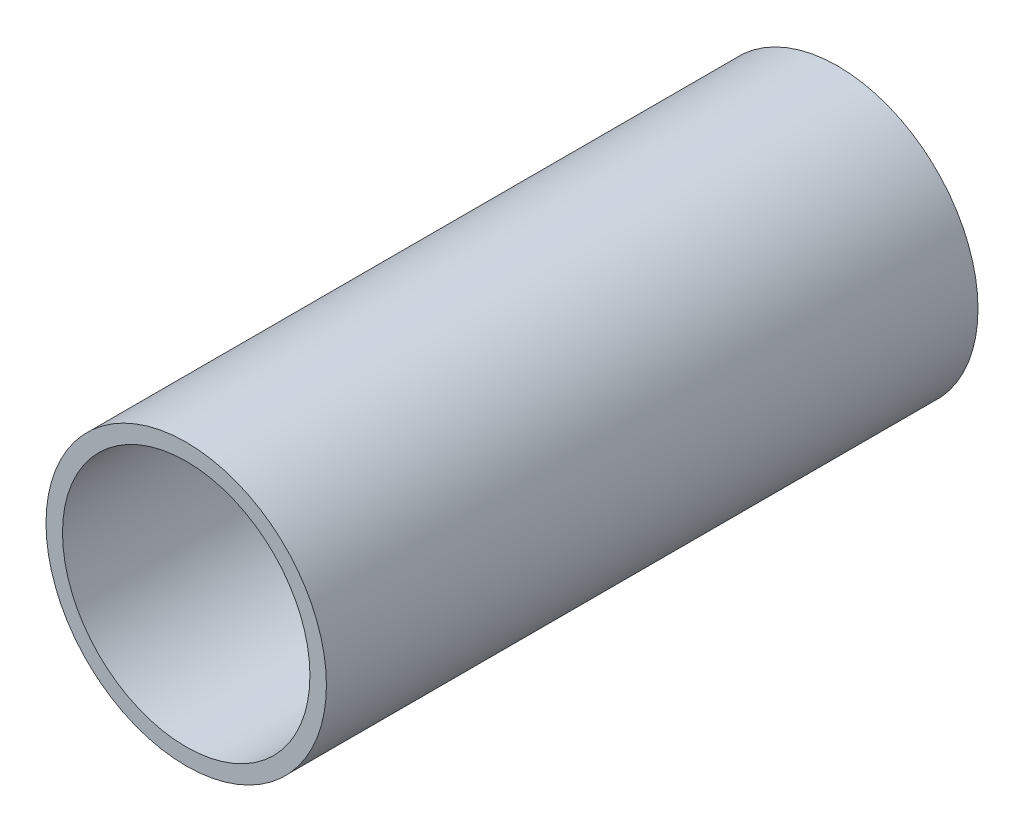
ISO-10303-21;
HEADER;
FILE_DESCRIPTION(('STEP AP214'),'2;1');
FILE_NAME('part.step','',(''),(''),'','','');
FILE_SCHEMA(('AUTOMOTIVE_DESIGN { 1 0 10303 214 1 1 1 1 }'));
ENDSEC;
DATA;
#1=APPLICATION_CONTEXT('core data for automotive mechanical design processes');
#2=APPLICATION_PROTOCOL_DEFINITION('international standard','automotive_design',2000,#1);
#3=PRODUCT_CONTEXT('',#1,'mechanical');
#4=PRODUCT('Part','Part','',(#3));
#5=PRODUCT_RELATED_PRODUCT_CATEGORY('part','',(#4));
#6=PRODUCT_DEFINITION_FORMATION('','',#4);
#7=PRODUCT_DEFINITION_CONTEXT('part definition',#1,'design');
#8=PRODUCT_DEFINITION('design','',#6,#7);
#9=PRODUCT_DEFINITION_SHAPE('','',#8);
#10=(LENGTH_UNIT() NAMED_UNIT(*) SI_UNIT(.MILLI.,.METRE.));
#11=(NAMED_UNIT(*) PLANE_ANGLE_UNIT() SI_UNIT($,.RADIAN.));
#12=(NAMED_UNIT(*) SI_UNIT($,.STERADIAN.) SOLID_ANGLE_UNIT());
#13=UNCERTAINTY_MEASURE_WITH_UNIT(LENGTH_MEASURE(1.E-05),#10,'distance_accuracy_value','');
#14=(GEOMETRIC_REPRESENTATION_CONTEXT(3) GLOBAL_UNCERTAINTY_ASSIGNED_CONTEXT((#13)) GLOBAL_UNIT_ASSIGNED_CONTEXT((#10,
#11,#12)) REPRESENTATION_CONTEXT('',''));
#15=CARTESIAN_POINT('',(0.,0.,0.));
#16=DIRECTION('',(0.,0.,1.));
#17=DIRECTION('',(1.,0.,0.));
#18=AXIS2_PLACEMENT_3D('',#15,#16,#17);
#19=CARTESIAN_POINT('',(0.,0.,395.));
#20=DIRECTION('',(0.,0.,1.));
#21=DIRECTION('',(1.,0.,0.));
#22=AXIS2_PLACEMENT_3D('',#19,#20,#21);
#23=PLANE('',#22);
#24=CARTESIAN_POINT('',(0.,0.,395.));
#25=DIRECTION('',(0.,0.,1.));
#26=DIRECTION('',(1.,0.,0.));
#27=AXIS2_PLACEMENT_3D('',#24,#25,#26);
#28=CIRCLE('',#27,85.);
#29=CARTESIAN_POINT('',(-85.,0.,395.));
#30=VERTEX_POINT('',#29);
#31=EDGE_CURVE('E10',#30,#30,#28,.T.);
#32=ORIENTED_EDGE('',*,*,#31,.T.);
#33=EDGE_LOOP('',(#32));
#34=FACE_BOUND('',#33,.T.);
#35=CARTESIAN_POINT('',(0.,0.,395.));
#36=DIRECTION('',(0.,0.,1.));
#37=DIRECTION('',(1.,0.,0.));
#38=AXIS2_PLACEMENT_3D('',#35,#36,#37);
#39=CIRCLE('',#38,75.);
#40=CARTESIAN_POINT('',(-75.,0.,395.));
#41=VERTEX_POINT('',#40);
#42=EDGE_CURVE('E41',#41,#41,#39,.T.);
#43=ORIENTED_EDGE('',*,*,#42,.F.);
#44=EDGE_LOOP('',(#43));
#45=FACE_BOUND('',#44,.T.);
#46=ADVANCED_FACE('F30',(#34,#45),#23,.T.);
#47=CARTESIAN_POINT('',(0.,0.,0.));
#48=DIRECTION('',(0.,0.,1.));
#49=DIRECTION('',(1.,0.,0.));
#50=AXIS2_PLACEMENT_3D('',#47,#48,#49);
#51=PLANE('',#50);
#52=CARTESIAN_POINT('',(0.,0.,0.));
#53=DIRECTION('',(0.,0.,1.));
#54=DIRECTION('',(1.,0.,0.));
#55=AXIS2_PLACEMENT_3D('',#52,#53,#54);
#56=CIRCLE('',#55,85.);
#57=CARTESIAN_POINT('',(-85.,0.,0.));
#58=VERTEX_POINT('',#57);
#59=EDGE_CURVE('E34',#58,#58,#56,.T.);
#60=ORIENTED_EDGE('',*,*,#59,.F.);
#61=EDGE_LOOP('',(#60));
#62=FACE_BOUND('',#61,.T.);
#63=CARTESIAN_POINT('',(0.,0.,0.));
#64=DIRECTION('',(0.,0.,1.));
#65=DIRECTION('',(1.,0.,0.));
#66=AXIS2_PLACEMENT_3D('',#63,#64,#65);
#67=CIRCLE('',#66,75.);
#68=CARTESIAN_POINT('',(-75.,0.,0.));
#69=VERTEX_POINT('',#68);
#70=EDGE_CURVE('E43',#69,#69,#67,.T.);
#71=ORIENTED_EDGE('',*,*,#70,.T.);
#72=EDGE_LOOP('',(#71));
#73=FACE_BOUND('',#72,.T.);
#74=ADVANCED_FACE('F53',(#62,#73),#51,.F.);
#75=CARTESIAN_POINT('',(0.,0.,395.));
#76=DIRECTION('',(0.,0.,-1.));
#77=DIRECTION('',(-1.,0.,0.));
#78=AXIS2_PLACEMENT_3D('',#75,#76,#77);
#79=CYLINDRICAL_SURFACE('',#78,85.);
#80=CARTESIAN_POINT('',(-85.,0.,395.));
#81=CARTESIAN_POINT('',(-85.,0.,390.885416666667));
#82=CARTESIAN_POINT('',(-85.,0.,386.770833333333));
#83=CARTESIAN_POINT('',(-85.,0.,378.541666666667));
#84=CARTESIAN_POINT('',(-85.,0.,374.427083333333));
#85=CARTESIAN_POINT('',(-85.,0.,366.197916666667));
#86=CARTESIAN_POINT('',(-85.,0.,362.083333333333));
#87=CARTESIAN_POINT('',(-85.,0.,353.854166666667));
#88=CARTESIAN_POINT('',(-85.,0.,349.739583333333));
#89=CARTESIAN_POINT('',(-85.,0.,341.510416666667));
#90=CARTESIAN_POINT('',(-85.,0.,337.395833333333));
#91=CARTESIAN_POINT('',(-85.,0.,329.166666666667));
#92=CARTESIAN_POINT('',(-85.,0.,325.052083333333));
#93=CARTESIAN_POINT('',(-85.,0.,316.822916666667));
#94=CARTESIAN_POINT('',(-85.,0.,312.708333333333));
#95=CARTESIAN_POINT('',(-85.,0.,304.479166666667));
#96=CARTESIAN_POINT('',(-85.,0.,300.364583333333));
#97=CARTESIAN_POINT('',(-85.,0.,292.135416666667));
#98=CARTESIAN_POINT('',(-85.,0.,288.020833333333));
#99=CARTESIAN_POINT('',(-85.,0.,279.791666666667));
#100=CARTESIAN_POINT('',(-85.,0.,275.677083333333));
#101=CARTESIAN_POINT('',(-85.,0.,267.447916666667));
#102=CARTESIAN_POINT('',(-85.,0.,263.333333333333));
#103=CARTESIAN_POINT('',(-85.,0.,255.104166666667));
#104=CARTESIAN_POINT('',(-85.,0.,250.989583333333));
#105=CARTESIAN_POINT('',(-85.,0.,242.760416666667));
#106=CARTESIAN_POINT('',(-85.,0.,238.645833333333));
#107=CARTESIAN_POINT('',(-85.,0.,230.416666666667));
#108=CARTESIAN_POINT('',(-85.,0.,226.302083333333));
#109=CARTESIAN_POINT('',(-85.,0.,218.072916666667));
#110=CARTESIAN_POINT('',(-85.,0.,213.958333333333));
#111=CARTESIAN_POINT('',(-85.,0.,205.729166666667));
#112=CARTESIAN_POINT('',(-85.,0.,201.614583333333));
#113=CARTESIAN_POINT('',(-85.,0.,193.385416666667));
#114=CARTESIAN_POINT('',(-85.,0.,189.270833333333));
#115=CARTESIAN_POINT('',(-85.,0.,181.041666666667));
#116=CARTESIAN_POINT('',(-85.,0.,176.927083333333));
#117=CARTESIAN_POINT('',(-85.,0.,168.697916666667));
#118=CARTESIAN_POINT('',(-85.,0.,164.583333333333));
#119=CARTESIAN_POINT('',(-85.,0.,156.354166666667));
#120=CARTESIAN_POINT('',(-85.,0.,152.239583333333));
#121=CARTESIAN_POINT('',(-85.,0.,144.010416666667));
#122=CARTESIAN_POINT('',(-85.,0.,139.895833333333));
#123=CARTESIAN_POINT('',(-85.,0.,131.666666666667));
#124=CARTESIAN_POINT('',(-85.,0.,127.552083333333));
#125=CARTESIAN_POINT('',(-85.,0.,119.322916666667));
#126=CARTESIAN_POINT('',(-85.,0.,115.208333333333));
#127=CARTESIAN_POINT('',(-85.,0.,106.979166666667));
#128=CARTESIAN_POINT('',(-85.,0.,102.864583333333));
#129=CARTESIAN_POINT('',(-85.,0.,94.6354166666666));
#130=CARTESIAN_POINT('',(-85.,0.,90.5208333333333));
#131=CARTESIAN_POINT('',(-85.,0.,82.2916666666666));
#132=CARTESIAN_POINT('',(-85.,0.,78.1770833333333));
#133=CARTESIAN_POINT('',(-85.,0.,69.9479166666667));
#134=CARTESIAN_POINT('',(-85.,0.,65.8333333333333));
#135=CARTESIAN_POINT('',(-85.,0.,57.6041666666666));
#136=CARTESIAN_POINT('',(-85.,0.,53.4895833333333));
#137=CARTESIAN_POINT('',(-85.,0.,45.2604166666666));
#138=CARTESIAN_POINT('',(-85.,0.,41.1458333333333));
#139=CARTESIAN_POINT('',(-85.,0.,32.9166666666666));
#140=CARTESIAN_POINT('',(-85.,0.,28.8020833333333));
#141=CARTESIAN_POINT('',(-85.,0.,20.5729166666666));
#142=CARTESIAN_POINT('',(-85.,0.,16.4583333333333));
#143=CARTESIAN_POINT('',(-85.,0.,8.2291666666666));
#144=CARTESIAN_POINT('',(-85.,0.,4.11458333333327));
#145=CARTESIAN_POINT('',(-85.,0.,0.));
#146=B_SPLINE_CURVE_WITH_KNOTS('',3,(#80,#81,#82,#83,#84,#85,#86,#87,#88,#89,#90,#91,#92,#93,
#94,#95,#96,#97,#98,#99,#100,#101,#102,#103,#104,#105,#106,#107,#108,#109,#110,#111,#112,#113,
#114,#115,#116,#117,#118,#119,#120,#121,#122,#123,#124,#125,#126,#127,#128,#129,#130,#131,#132,
#133,#134,#135,#136,#137,#138,#139,#140,#141,#142,#143,#144,#145),.UNSPECIFIED.,.F.,.F.,(4,2,2,
2,2,2,2,2,2,2,2,2,2,2,2,2,2,2,2,2,2,2,2,2,2,2,2,2,2,2,2,2,4),(0.,12.34375,24.6875,37.03125,
49.3750000000001,61.71875,74.0625,86.40625,98.7500000000001,111.09375,123.4375,135.78125,
148.125,160.46875,172.8125,185.15625,197.5,209.84375,222.1875,234.53125,246.875,259.21875,
271.5625,283.90625,296.25,308.59375,320.9375,333.28125,345.625,357.96875,370.3125,382.65625,
395.),.UNSPECIFIED.);
#147=EDGE_CURVE('BSEAM32',#30,#58,#146,.T.);
#148=ORIENTED_EDGE('',*,*,#31,.F.);
#149=ORIENTED_EDGE('',*,*,#59,.T.);
#150=ORIENTED_EDGE('',*,*,#147,.T.);
#151=ORIENTED_EDGE('',*,*,#147,.F.);
#152=EDGE_LOOP('',(#148,#150,#149,#151));
#153=FACE_BOUND('',#152,.T.);
#154=ADVANCED_FACE('F32',(#153),#79,.T.);
#155=CARTESIAN_POINT('',(0.,0.,395.));
#156=DIRECTION('',(0.,0.,-1.));
#157=DIRECTION('',(-1.,0.,0.));
#158=AXIS2_PLACEMENT_3D('',#155,#156,#157);
#159=CYLINDRICAL_SURFACE('',#158,75.);
#160=CARTESIAN_POINT('',(-75.,0.,395.));
#161=CARTESIAN_POINT('',(-75.,0.,390.885416666667));
#162=CARTESIAN_POINT('',(-75.,0.,386.770833333333));
#163=CARTESIAN_POINT('',(-75.,0.,378.541666666667));
#164=CARTESIAN_POINT('',(-75.,0.,374.427083333333));
#165=CARTESIAN_POINT('',(-75.,0.,366.197916666667));
#166=CARTESIAN_POINT('',(-75.,0.,362.083333333333));
#167=CARTESIAN_POINT('',(-75.,0.,353.854166666667));
#168=CARTESIAN_POINT('',(-75.,0.,349.739583333333));
#169=CARTESIAN_POINT('',(-75.,0.,341.510416666667));
#170=CARTESIAN_POINT('',(-75.,0.,337.395833333333));
#171=CARTESIAN_POINT('',(-75.,0.,329.166666666667));
#172=CARTESIAN_POINT('',(-75.,0.,325.052083333333));
#173=CARTESIAN_POINT('',(-75.,0.,316.822916666667));
#174=CARTESIAN_POINT('',(-75.,0.,312.708333333333));
#175=CARTESIAN_POINT('',(-75.,0.,304.479166666667));
#176=CARTESIAN_POINT('',(-75.,0.,300.364583333333));
#177=CARTESIAN_POINT('',(-75.,0.,292.135416666667));
#178=CARTESIAN_POINT('',(-75.,0.,288.020833333333));
#179=CARTESIAN_POINT('',(-75.,0.,279.791666666667));
#180=CARTESIAN_POINT('',(-75.,0.,275.677083333333));
#181=CARTESIAN_POINT('',(-75.,0.,267.447916666667));
#182=CARTESIAN_POINT('',(-75.,0.,263.333333333333));
#183=CARTESIAN_POINT('',(-75.,0.,255.104166666667));
#184=CARTESIAN_POINT('',(-75.,0.,250.989583333333));
#185=CARTESIAN_POINT('',(-75.,0.,242.760416666667));
#186=CARTESIAN_POINT('',(-75.,0.,238.645833333333));
#187=CARTESIAN_POINT('',(-75.,0.,230.416666666667));
#188=CARTESIAN_POINT('',(-75.,0.,226.302083333333));
#189=CARTESIAN_POINT('',(-75.,0.,218.072916666667));
#190=CARTESIAN_POINT('',(-75.,0.,213.958333333333));
#191=CARTESIAN_POINT('',(-75.,0.,205.729166666667));
#192=CARTESIAN_POINT('',(-75.,0.,201.614583333333));
#193=CARTESIAN_POINT('',(-75.,0.,193.385416666667));
#194=CARTESIAN_POINT('',(-75.,0.,189.270833333333));
#195=CARTESIAN_POINT('',(-75.,0.,181.041666666667));
#196=CARTESIAN_POINT('',(-75.,0.,176.927083333333));
#197=CARTESIAN_POINT('',(-75.,0.,168.697916666667));
#198=CARTESIAN_POINT('',(-75.,0.,164.583333333333));
#199=CARTESIAN_POINT('',(-75.,0.,156.354166666667));
#200=CARTESIAN_POINT('',(-75.,0.,152.239583333333));
#201=CARTESIAN_POINT('',(-75.,0.,144.010416666667));
#202=CARTESIAN_POINT('',(-75.,0.,139.895833333333));
#203=CARTESIAN_POINT('',(-75.,0.,131.666666666667));
#204=CARTESIAN_POINT('',(-75.,0.,127.552083333333));
#205=CARTESIAN_POINT('',(-75.,0.,119.322916666667));
#206=CARTESIAN_POINT('',(-75.,0.,115.208333333333));
#207=CARTESIAN_POINT('',(-75.,0.,106.979166666667));
#208=CARTESIAN_POINT('',(-75.,0.,102.864583333333));
#209=CARTESIAN_POINT('',(-75.,0.,94.6354166666666));
#210=CARTESIAN_POINT('',(-75.,0.,90.5208333333333));
#211=CARTESIAN_POINT('',(-75.,0.,82.2916666666666));
#212=CARTESIAN_POINT('',(-75.,0.,78.1770833333333));
#213=CARTESIAN_POINT('',(-75.,0.,69.9479166666666));
#214=CARTESIAN_POINT('',(-75.,0.,65.8333333333333));
#215=CARTESIAN_POINT('',(-75.,0.,57.6041666666666));
#216=CARTESIAN_POINT('',(-75.,0.,53.4895833333333));
#217=CARTESIAN_POINT('',(-75.,0.,45.2604166666666));
#218=CARTESIAN_POINT('',(-75.,0.,41.1458333333333));
#219=CARTESIAN_POINT('',(-75.,0.,32.9166666666666));
#220=CARTESIAN_POINT('',(-75.,0.,28.8020833333333));
#221=CARTESIAN_POINT('',(-75.,0.,20.5729166666666));
#222=CARTESIAN_POINT('',(-75.,0.,16.4583333333333));
#223=CARTESIAN_POINT('',(-75.,0.,8.2291666666666));
#224=CARTESIAN_POINT('',(-75.,0.,4.11458333333327));
#225=CARTESIAN_POINT('',(-75.,0.,0.));
#226=B_SPLINE_CURVE_WITH_KNOTS('',3,(#160,#161,#162,#163,#164,#165,#166,#167,#168,#169,#170,
#171,#172,#173,#174,#175,#176,#177,#178,#179,#180,#181,#182,#183,#184,#185,#186,#187,#188,#189,
#190,#191,#192,#193,#194,#195,#196,#197,#198,#199,#200,#201,#202,#203,#204,#205,#206,#207,#208,
#209,#210,#211,#212,#213,#214,#215,#216,#217,#218,#219,#220,#221,#222,#223,#224,#225),
.UNSPECIFIED.,.F.,.F.,(4,2,2,2,2,2,2,2,2,2,2,2,2,2,2,2,2,2,2,2,2,2,2,2,2,2,2,2,2,2,2,2,4),(0.,
12.34375,24.6875,37.03125,49.375,61.71875,74.0625,86.40625,98.7499999999999,111.09375,123.4375,
135.78125,148.125,160.46875,172.8125,185.15625,197.5,209.84375,222.1875,234.53125,246.875,
259.21875,271.5625,283.90625,296.25,308.59375,320.9375,333.28125,345.625,357.96875,370.3125,
382.65625,395.),.UNSPECIFIED.);
#227=EDGE_CURVE('BSEAM49',#41,#69,#226,.T.);
#228=ORIENTED_EDGE('',*,*,#42,.T.);
#229=ORIENTED_EDGE('',*,*,#70,.F.);
#230=ORIENTED_EDGE('',*,*,#227,.T.);
#231=ORIENTED_EDGE('',*,*,#227,.F.);
#232=EDGE_LOOP('',(#228,#230,#229,#231));
#233=FACE_BOUND('',#232,.T.);
#234=ADVANCED_FACE('F49',(#233),#159,.F.);
#235=CLOSED_SHELL('',(#46,#74,#154,#234));
#236=MANIFOLD_SOLID_BREP('B2',#235);
#237=ADVANCED_BREP_SHAPE_REPRESENTATION('',(#18,#236),#14);
#238=SHAPE_DEFINITION_REPRESENTATION(#9,#237);
ENDSEC;
END-ISO-10303-21;
